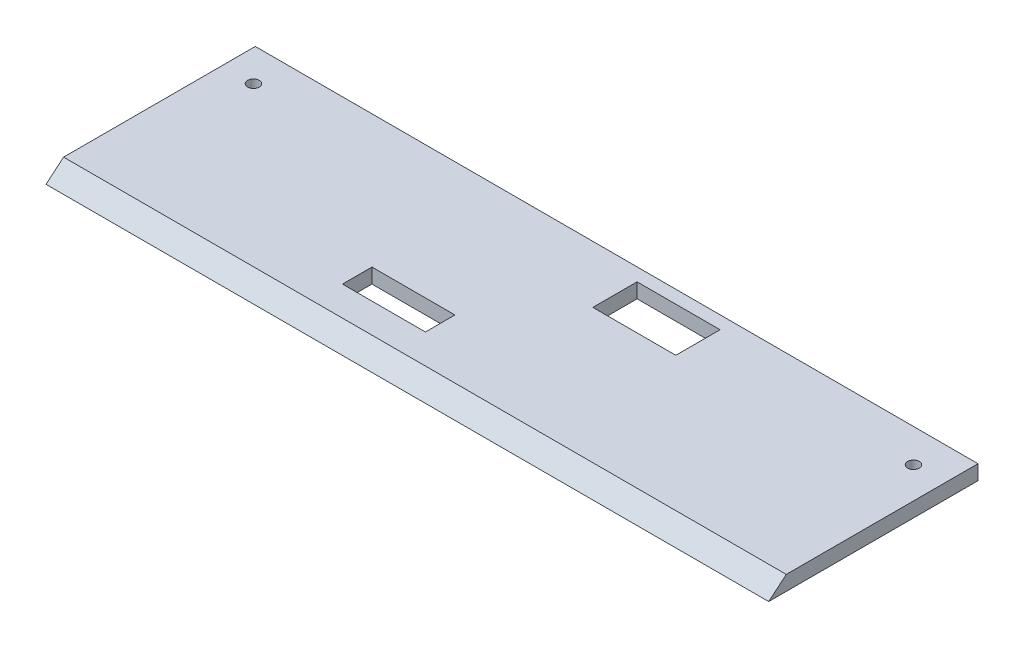
ISO-10303-21;
HEADER;
FILE_DESCRIPTION(('STEP AP214'),'2;1');
FILE_NAME('part.step','',(''),(''),'','','');
FILE_SCHEMA(('AUTOMOTIVE_DESIGN { 1 0 10303 214 1 1 1 1 }'));
ENDSEC;
DATA;
#1=APPLICATION_CONTEXT('core data for automotive mechanical design processes');
#2=APPLICATION_PROTOCOL_DEFINITION('international standard','automotive_design',2000,#1);
#3=PRODUCT_CONTEXT('',#1,'mechanical');
#4=PRODUCT('Part','Part','',(#3));
#5=PRODUCT_RELATED_PRODUCT_CATEGORY('part','',(#4));
#6=PRODUCT_DEFINITION_FORMATION('','',#4);
#7=PRODUCT_DEFINITION_CONTEXT('part definition',#1,'design');
#8=PRODUCT_DEFINITION('design','',#6,#7);
#9=PRODUCT_DEFINITION_SHAPE('','',#8);
#10=(LENGTH_UNIT() NAMED_UNIT(*) SI_UNIT(.MILLI.,.METRE.));
#11=(NAMED_UNIT(*) PLANE_ANGLE_UNIT() SI_UNIT($,.RADIAN.));
#12=(NAMED_UNIT(*) SI_UNIT($,.STERADIAN.) SOLID_ANGLE_UNIT());
#13=UNCERTAINTY_MEASURE_WITH_UNIT(LENGTH_MEASURE(1.E-05),#10,'distance_accuracy_value','');
#14=(GEOMETRIC_REPRESENTATION_CONTEXT(3) GLOBAL_UNCERTAINTY_ASSIGNED_CONTEXT((#13)) GLOBAL_UNIT_ASSIGNED_CONTEXT((#10,
#11,#12)) REPRESENTATION_CONTEXT('',''));
#15=CARTESIAN_POINT('',(0.,0.,0.));
#16=DIRECTION('',(0.,0.,1.));
#17=DIRECTION('',(1.,0.,0.));
#18=AXIS2_PLACEMENT_3D('',#15,#16,#17);
#19=CARTESIAN_POINT('',(0.,41.19,0.));
#20=DIRECTION('',(0.,-1.,0.));
#21=DIRECTION('',(0.,0.,-1.));
#22=AXIS2_PLACEMENT_3D('',#19,#20,#21);
#23=PLANE('',#22);
#24=DIRECTION('',(0.,0.,-1.));
#25=VECTOR('',#24,1.);
#26=CARTESIAN_POINT('',(0.,41.19,0.));
#27=LINE('',#26,#25);
#28=CARTESIAN_POINT('',(0.,41.19,-49.0883304789554));
#29=VERTEX_POINT('',#28);
#30=CARTESIAN_POINT('',(0.,41.19,-105.85));
#31=VERTEX_POINT('',#30);
#32=EDGE_CURVE('E150',#29,#31,#27,.T.);
#33=ORIENTED_EDGE('',*,*,#32,.T.);
#34=DIRECTION('',(1.,0.,0.));
#35=VECTOR('',#34,1.);
#36=CARTESIAN_POINT('',(159.,41.19,-105.85));
#37=LINE('',#36,#35);
#38=CARTESIAN_POINT('',(196.,41.19,-105.85));
#39=VERTEX_POINT('',#38);
#40=EDGE_CURVE('E207',#31,#39,#37,.T.);
#41=ORIENTED_EDGE('',*,*,#40,.T.);
#42=DIRECTION('',(0.,0.,-1.));
#43=VECTOR('',#42,1.);
#44=CARTESIAN_POINT('',(196.,41.19,0.));
#45=LINE('',#44,#43);
#46=CARTESIAN_POINT('',(196.,41.19,-49.0883304789554));
#47=VERTEX_POINT('',#46);
#48=EDGE_CURVE('E152',#47,#39,#45,.T.);
#49=ORIENTED_EDGE('',*,*,#48,.F.);
#50=DIRECTION('',(-1.,0.,0.));
#51=VECTOR('',#50,1.);
#52=CARTESIAN_POINT('',(196.,41.19,-49.0883304789554));
#53=LINE('',#52,#51);
#54=EDGE_CURVE('E138',#47,#29,#53,.T.);
#55=ORIENTED_EDGE('',*,*,#54,.T.);
#56=EDGE_LOOP('',(#33,#41,#49,#55));
#57=FACE_BOUND('',#56,.T.);
#58=CARTESIAN_POINT('',(187.5,41.19,-96.85));
#59=DIRECTION('',(0.,-1.,0.));
#60=DIRECTION('',(0.,0.,-1.));
#61=AXIS2_PLACEMENT_3D('',#58,#59,#60);
#62=CIRCLE('',#61,1.58499999999999);
#63=CARTESIAN_POINT('',(187.5,41.19,-95.265));
#64=VERTEX_POINT('',#63);
#65=EDGE_CURVE('E236',#64,#64,#62,.T.);
#66=ORIENTED_EDGE('',*,*,#65,.F.);
#67=EDGE_LOOP('',(#66));
#68=FACE_BOUND('',#67,.T.);
#69=CARTESIAN_POINT('',(8.5,41.19,-96.85));
#70=DIRECTION('',(0.,-1.,0.));
#71=DIRECTION('',(0.,0.,-1.));
#72=AXIS2_PLACEMENT_3D('',#69,#70,#71);
#73=CIRCLE('',#72,1.58499999999999);
#74=CARTESIAN_POINT('',(8.5,41.19,-98.435));
#75=VERTEX_POINT('',#74);
#76=EDGE_CURVE('E156',#75,#75,#73,.F.);
#77=ORIENTED_EDGE('',*,*,#76,.T.);
#78=EDGE_LOOP('',(#77));
#79=FACE_BOUND('',#78,.T.);
#80=DIRECTION('',(0.,0.,1.));
#81=VECTOR('',#80,1.);
#82=CARTESIAN_POINT('',(107.057542755314,41.19,-102.335344849332));
#83=LINE('',#82,#81);
#84=CARTESIAN_POINT('',(107.057542755314,41.19,-102.335344849332));
#85=VERTEX_POINT('',#84);
#86=CARTESIAN_POINT('',(107.057542755314,41.19,-90.3353448493322));
#87=VERTEX_POINT('',#86);
#88=EDGE_CURVE('E223',#85,#87,#83,.T.);
#89=ORIENTED_EDGE('',*,*,#88,.T.);
#90=DIRECTION('',(1.,0.,0.));
#91=VECTOR('',#90,1.);
#92=CARTESIAN_POINT('',(107.057542755314,41.19,-90.3353448493322));
#93=LINE('',#92,#91);
#94=CARTESIAN_POINT('',(129.557542755314,41.19,-90.3353448493322));
#95=VERTEX_POINT('',#94);
#96=EDGE_CURVE('E231',#87,#95,#93,.T.);
#97=ORIENTED_EDGE('',*,*,#96,.T.);
#98=DIRECTION('',(0.,0.,-1.));
#99=VECTOR('',#98,1.);
#100=CARTESIAN_POINT('',(129.557542755314,41.19,-102.335344849332));
#101=LINE('',#100,#99);
#102=CARTESIAN_POINT('',(129.557542755314,41.19,-102.335344849332));
#103=VERTEX_POINT('',#102);
#104=EDGE_CURVE('E228',#95,#103,#101,.T.);
#105=ORIENTED_EDGE('',*,*,#104,.T.);
#106=DIRECTION('',(-1.,0.,0.));
#107=VECTOR('',#106,1.);
#108=CARTESIAN_POINT('',(107.057542755314,41.19,-102.335344849332));
#109=LINE('',#108,#107);
#110=EDGE_CURVE('E216',#103,#85,#109,.T.);
#111=ORIENTED_EDGE('',*,*,#110,.T.);
#112=EDGE_LOOP('',(#89,#97,#105,#111));
#113=FACE_BOUND('',#112,.T.);
#114=DIRECTION('',(0.,0.,1.));
#115=VECTOR('',#114,1.);
#116=CARTESIAN_POINT('',(67.6351039484169,41.19,-61.8553448493322));
#117=LINE('',#116,#115);
#118=CARTESIAN_POINT('',(67.6351039484169,41.19,-69.8553448493322));
#119=VERTEX_POINT('',#118);
#120=CARTESIAN_POINT('',(67.6351039484169,41.19,-61.8553448493322));
#121=VERTEX_POINT('',#120);
#122=EDGE_CURVE('E198',#119,#121,#117,.T.);
#123=ORIENTED_EDGE('',*,*,#122,.T.);
#124=DIRECTION('',(1.,0.,0.));
#125=VECTOR('',#124,1.);
#126=CARTESIAN_POINT('',(67.6351039484169,41.19,-61.8553448493322));
#127=LINE('',#126,#125);
#128=CARTESIAN_POINT('',(90.1351039484169,41.19,-61.8553448493322));
#129=VERTEX_POINT('',#128);
#130=EDGE_CURVE('E145',#121,#129,#127,.T.);
#131=ORIENTED_EDGE('',*,*,#130,.T.);
#132=DIRECTION('',(0.,0.,-1.));
#133=VECTOR('',#132,1.);
#134=CARTESIAN_POINT('',(90.1351039484169,41.19,-61.8553448493322));
#135=LINE('',#134,#133);
#136=CARTESIAN_POINT('',(90.1351039484169,41.19,-69.8553448493322));
#137=VERTEX_POINT('',#136);
#138=EDGE_CURVE('E204',#129,#137,#135,.T.);
#139=ORIENTED_EDGE('',*,*,#138,.T.);
#140=DIRECTION('',(-1.,0.,0.));
#141=VECTOR('',#140,1.);
#142=CARTESIAN_POINT('',(67.6351039484169,41.19,-69.8553448493322));
#143=LINE('',#142,#141);
#144=EDGE_CURVE('E201',#137,#119,#143,.T.);
#145=ORIENTED_EDGE('',*,*,#144,.T.);
#146=EDGE_LOOP('',(#123,#131,#139,#145));
#147=FACE_BOUND('',#146,.T.);
#148=ADVANCED_FACE('F38',(#57,#68,#79,#113,#147),#23,.T.);
#149=CARTESIAN_POINT('',(196.,0.,0.));
#150=DIRECTION('',(0.,-0.766044443118977,-0.64278760968654));
#151=DIRECTION('',(0.,0.64278760968654,-0.766044443118977));
#152=AXIS2_PLACEMENT_3D('',#149,#150,#151);
#153=PLANE('',#152);
#154=ORIENTED_EDGE('',*,*,#54,.F.);
#155=DIRECTION('',(0.,-0.64278760968654,0.766044443118977));
#156=VECTOR('',#155,1.);
#157=CARTESIAN_POINT('',(196.,0.,0.));
#158=LINE('',#157,#156);
#159=CARTESIAN_POINT('',(196.,45.19,-53.8553448493322));
#160=VERTEX_POINT('',#159);
#161=EDGE_CURVE('E164',#160,#47,#158,.T.);
#162=ORIENTED_EDGE('',*,*,#161,.F.);
#163=DIRECTION('',(-1.,0.,0.));
#164=VECTOR('',#163,1.);
#165=CARTESIAN_POINT('',(196.,45.19,-53.8553448493322));
#166=LINE('',#165,#164);
#167=CARTESIAN_POINT('',(0.,45.19,-53.8553448493322));
#168=VERTEX_POINT('',#167);
#169=EDGE_CURVE('E141',#160,#168,#166,.T.);
#170=ORIENTED_EDGE('',*,*,#169,.T.);
#171=DIRECTION('',(0.,-0.64278760968654,0.766044443118977));
#172=VECTOR('',#171,1.);
#173=CARTESIAN_POINT('',(0.,0.,0.));
#174=LINE('',#173,#172);
#175=EDGE_CURVE('E42',#168,#29,#174,.T.);
#176=ORIENTED_EDGE('',*,*,#175,.T.);
#177=EDGE_LOOP('',(#154,#162,#170,#176));
#178=FACE_BOUND('',#177,.T.);
#179=ADVANCED_FACE('F136',(#178),#153,.F.);
#180=CARTESIAN_POINT('',(196.,0.,-105.85));
#181=DIRECTION('',(0.,0.,1.));
#182=DIRECTION('',(1.,0.,0.));
#183=AXIS2_PLACEMENT_3D('',#180,#181,#182);
#184=PLANE('',#183);
#185=ORIENTED_EDGE('',*,*,#40,.F.);
#186=DIRECTION('',(0.,1.,0.));
#187=VECTOR('',#186,1.);
#188=CARTESIAN_POINT('',(0.,0.,-105.85));
#189=LINE('',#188,#187);
#190=CARTESIAN_POINT('',(0.,45.19,-105.85));
#191=VERTEX_POINT('',#190);
#192=EDGE_CURVE('E146',#31,#191,#189,.T.);
#193=ORIENTED_EDGE('',*,*,#192,.T.);
#194=DIRECTION('',(-1.,0.,0.));
#195=VECTOR('',#194,1.);
#196=CARTESIAN_POINT('',(196.,45.19,-105.85));
#197=LINE('',#196,#195);
#198=CARTESIAN_POINT('',(196.,45.19,-105.85));
#199=VERTEX_POINT('',#198);
#200=EDGE_CURVE('E238',#199,#191,#197,.T.);
#201=ORIENTED_EDGE('',*,*,#200,.F.);
#202=DIRECTION('',(0.,1.,0.));
#203=VECTOR('',#202,1.);
#204=CARTESIAN_POINT('',(196.,0.,-105.85));
#205=LINE('',#204,#203);
#206=EDGE_CURVE('E162',#39,#199,#205,.T.);
#207=ORIENTED_EDGE('',*,*,#206,.F.);
#208=EDGE_LOOP('',(#185,#193,#201,#207));
#209=FACE_BOUND('',#208,.T.);
#210=ADVANCED_FACE('F241',(#209),#184,.F.);
#211=CARTESIAN_POINT('',(196.,0.,0.));
#212=DIRECTION('',(1.,0.,0.));
#213=DIRECTION('',(0.,0.,-1.));
#214=AXIS2_PLACEMENT_3D('',#211,#212,#213);
#215=PLANE('',#214);
#216=ORIENTED_EDGE('',*,*,#161,.T.);
#217=ORIENTED_EDGE('',*,*,#48,.T.);
#218=ORIENTED_EDGE('',*,*,#206,.T.);
#219=DIRECTION('',(0.,0.,1.));
#220=VECTOR('',#219,1.);
#221=CARTESIAN_POINT('',(196.,45.19,-105.85));
#222=LINE('',#221,#220);
#223=EDGE_CURVE('E165',#199,#160,#222,.T.);
#224=ORIENTED_EDGE('',*,*,#223,.T.);
#225=EDGE_LOOP('',(#216,#217,#218,#224));
#226=FACE_BOUND('',#225,.T.);
#227=ADVANCED_FACE('F40',(#226),#215,.T.);
#228=CARTESIAN_POINT('',(0.,0.,0.));
#229=DIRECTION('',(1.,0.,0.));
#230=DIRECTION('',(0.,0.,-1.));
#231=AXIS2_PLACEMENT_3D('',#228,#229,#230);
#232=PLANE('',#231);
#233=ORIENTED_EDGE('',*,*,#32,.F.);
#234=ORIENTED_EDGE('',*,*,#175,.F.);
#235=DIRECTION('',(0.,0.,1.));
#236=VECTOR('',#235,1.);
#237=CARTESIAN_POINT('',(0.,45.19,-105.85));
#238=LINE('',#237,#236);
#239=EDGE_CURVE('E166',#191,#168,#238,.T.);
#240=ORIENTED_EDGE('',*,*,#239,.F.);
#241=ORIENTED_EDGE('',*,*,#192,.F.);
#242=EDGE_LOOP('',(#233,#234,#240,#241));
#243=FACE_BOUND('',#242,.T.);
#244=ADVANCED_FACE('F155',(#243),#232,.F.);
#245=CARTESIAN_POINT('',(8.5,0.,-96.85));
#246=DIRECTION('',(0.,1.,0.));
#247=DIRECTION('',(0.,0.,1.));
#248=AXIS2_PLACEMENT_3D('',#245,#246,#247);
#249=CYLINDRICAL_SURFACE('',#248,1.58499999999999);
#250=CARTESIAN_POINT('',(8.5,45.19,-96.85));
#251=DIRECTION('',(0.,1.,0.));
#252=DIRECTION('',(0.,0.,1.));
#253=AXIS2_PLACEMENT_3D('',#250,#251,#252);
#254=CIRCLE('',#253,1.58499999999999);
#255=CARTESIAN_POINT('',(8.5,45.19,-95.265));
#256=VERTEX_POINT('',#255);
#257=EDGE_CURVE('E209',#256,#256,#254,.T.);
#258=ORIENTED_EDGE('',*,*,#257,.T.);
#259=EDGE_LOOP('',(#258));
#260=FACE_BOUND('',#259,.T.);
#261=ORIENTED_EDGE('',*,*,#76,.F.);
#262=EDGE_LOOP('',(#261));
#263=FACE_BOUND('',#262,.T.);
#264=ADVANCED_FACE('F256',(#260,#263),#249,.F.);
#265=CARTESIAN_POINT('',(187.5,0.,-96.85));
#266=DIRECTION('',(0.,1.,0.));
#267=DIRECTION('',(0.,0.,1.));
#268=AXIS2_PLACEMENT_3D('',#265,#266,#267);
#269=CYLINDRICAL_SURFACE('',#268,1.58499999999999);
#270=CARTESIAN_POINT('',(187.5,45.19,-96.85));
#271=DIRECTION('',(0.,-1.,0.));
#272=DIRECTION('',(0.,0.,1.));
#273=AXIS2_PLACEMENT_3D('',#270,#271,#272);
#274=CIRCLE('',#273,1.58499999999999);
#275=CARTESIAN_POINT('',(187.5,45.19,-95.265));
#276=VERTEX_POINT('',#275);
#277=EDGE_CURVE('E212',#276,#276,#274,.T.);
#278=CARTESIAN_POINT('',(187.5,45.19,-95.265));
#279=CARTESIAN_POINT('',(187.5,45.1483333333333,-95.265));
#280=CARTESIAN_POINT('',(187.5,45.1066666666667,-95.265));
#281=CARTESIAN_POINT('',(187.5,45.0233333333333,-95.265));
#282=CARTESIAN_POINT('',(187.5,44.9816666666667,-95.265));
#283=CARTESIAN_POINT('',(187.5,44.8983333333333,-95.265));
#284=CARTESIAN_POINT('',(187.5,44.8566666666667,-95.265));
#285=CARTESIAN_POINT('',(187.5,44.7733333333333,-95.265));
#286=CARTESIAN_POINT('',(187.5,44.7316666666667,-95.265));
#287=CARTESIAN_POINT('',(187.5,44.6483333333333,-95.265));
#288=CARTESIAN_POINT('',(187.5,44.6066666666667,-95.265));
#289=CARTESIAN_POINT('',(187.5,44.5233333333333,-95.265));
#290=CARTESIAN_POINT('',(187.5,44.4816666666667,-95.265));
#291=CARTESIAN_POINT('',(187.5,44.3983333333333,-95.265));
#292=CARTESIAN_POINT('',(187.5,44.3566666666667,-95.265));
#293=CARTESIAN_POINT('',(187.5,44.2733333333333,-95.265));
#294=CARTESIAN_POINT('',(187.5,44.2316666666667,-95.265));
#295=CARTESIAN_POINT('',(187.5,44.1483333333333,-95.265));
#296=CARTESIAN_POINT('',(187.5,44.1066666666667,-95.265));
#297=CARTESIAN_POINT('',(187.5,44.0233333333333,-95.265));
#298=CARTESIAN_POINT('',(187.5,43.9816666666667,-95.265));
#299=CARTESIAN_POINT('',(187.5,43.8983333333333,-95.265));
#300=CARTESIAN_POINT('',(187.5,43.8566666666667,-95.265));
#301=CARTESIAN_POINT('',(187.5,43.7733333333333,-95.265));
#302=CARTESIAN_POINT('',(187.5,43.7316666666667,-95.265));
#303=CARTESIAN_POINT('',(187.5,43.6483333333333,-95.265));
#304=CARTESIAN_POINT('',(187.5,43.6066666666667,-95.265));
#305=CARTESIAN_POINT('',(187.5,43.5233333333333,-95.265));
#306=CARTESIAN_POINT('',(187.5,43.4816666666667,-95.265));
#307=CARTESIAN_POINT('',(187.5,43.3983333333333,-95.265));
#308=CARTESIAN_POINT('',(187.5,43.3566666666667,-95.265));
#309=CARTESIAN_POINT('',(187.5,43.2733333333333,-95.265));
#310=CARTESIAN_POINT('',(187.5,43.2316666666667,-95.265));
#311=CARTESIAN_POINT('',(187.5,43.1483333333333,-95.265));
#312=CARTESIAN_POINT('',(187.5,43.1066666666667,-95.265));
#313=CARTESIAN_POINT('',(187.5,43.0233333333333,-95.265));
#314=CARTESIAN_POINT('',(187.5,42.9816666666667,-95.265));
#315=CARTESIAN_POINT('',(187.5,42.8983333333333,-95.265));
#316=CARTESIAN_POINT('',(187.5,42.8566666666667,-95.265));
#317=CARTESIAN_POINT('',(187.5,42.7733333333333,-95.265));
#318=CARTESIAN_POINT('',(187.5,42.7316666666667,-95.265));
#319=CARTESIAN_POINT('',(187.5,42.6483333333333,-95.265));
#320=CARTESIAN_POINT('',(187.5,42.6066666666667,-95.265));
#321=CARTESIAN_POINT('',(187.5,42.5233333333333,-95.265));
#322=CARTESIAN_POINT('',(187.5,42.4816666666667,-95.265));
#323=CARTESIAN_POINT('',(187.5,42.3983333333333,-95.265));
#324=CARTESIAN_POINT('',(187.5,42.3566666666667,-95.265));
#325=CARTESIAN_POINT('',(187.5,42.2733333333333,-95.265));
#326=CARTESIAN_POINT('',(187.5,42.2316666666667,-95.265));
#327=CARTESIAN_POINT('',(187.5,42.1483333333333,-95.265));
#328=CARTESIAN_POINT('',(187.5,42.1066666666667,-95.265));
#329=CARTESIAN_POINT('',(187.5,42.0233333333333,-95.265));
#330=CARTESIAN_POINT('',(187.5,41.9816666666667,-95.265));
#331=CARTESIAN_POINT('',(187.5,41.8983333333333,-95.265));
#332=CARTESIAN_POINT('',(187.5,41.8566666666667,-95.265));
#333=CARTESIAN_POINT('',(187.5,41.7733333333333,-95.265));
#334=CARTESIAN_POINT('',(187.5,41.7316666666667,-95.265));
#335=CARTESIAN_POINT('',(187.5,41.6483333333333,-95.265));
#336=CARTESIAN_POINT('',(187.5,41.6066666666667,-95.265));
#337=CARTESIAN_POINT('',(187.5,41.5233333333333,-95.265));
#338=CARTESIAN_POINT('',(187.5,41.4816666666667,-95.265));
#339=CARTESIAN_POINT('',(187.5,41.3983333333333,-95.265));
#340=CARTESIAN_POINT('',(187.5,41.3566666666667,-95.265));
#341=CARTESIAN_POINT('',(187.5,41.2733333333333,-95.265));
#342=CARTESIAN_POINT('',(187.5,41.2316666666667,-95.265));
#343=CARTESIAN_POINT('',(187.5,41.19,-95.265));
#344=B_SPLINE_CURVE_WITH_KNOTS('',3,(#278,#279,#280,#281,#282,#283,#284,#285,#286,#287,#288,
#289,#290,#291,#292,#293,#294,#295,#296,#297,#298,#299,#300,#301,#302,#303,#304,#305,#306,#307,
#308,#309,#310,#311,#312,#313,#314,#315,#316,#317,#318,#319,#320,#321,#322,#323,#324,#325,#326,
#327,#328,#329,#330,#331,#332,#333,#334,#335,#336,#337,#338,#339,#340,#341,#342,#343),
.UNSPECIFIED.,.F.,.F.,(4,2,2,2,2,2,2,2,2,2,2,2,2,2,2,2,2,2,2,2,2,2,2,2,2,2,2,2,2,2,2,2,4),(0.,
0.125,0.25,0.375,0.5,0.625000000000001,0.750000000000001,0.875000000000001,1.,1.125,1.25,1.375,
1.5,1.625,1.75,1.875,2.,2.125,2.25,2.375,2.5,2.625,2.75,2.875,3.,3.125,3.25,3.375,3.5,3.625,
3.75,3.875,4.),.UNSPECIFIED.);
#345=EDGE_CURVE('BSEAM246',#276,#64,#344,.T.);
#346=ORIENTED_EDGE('',*,*,#277,.F.);
#347=ORIENTED_EDGE('',*,*,#65,.T.);
#348=ORIENTED_EDGE('',*,*,#345,.T.);
#349=ORIENTED_EDGE('',*,*,#345,.F.);
#350=EDGE_LOOP('',(#346,#348,#347,#349));
#351=FACE_BOUND('',#350,.T.);
#352=ADVANCED_FACE('F246',(#351),#269,.F.);
#353=CARTESIAN_POINT('',(196.,45.19,-105.85));
#354=DIRECTION('',(0.,-1.,0.));
#355=DIRECTION('',(0.,0.,-1.));
#356=AXIS2_PLACEMENT_3D('',#353,#354,#355);
#357=PLANE('',#356);
#358=DIRECTION('',(1.,0.,0.));
#359=VECTOR('',#358,1.);
#360=CARTESIAN_POINT('',(107.057542755314,45.19,-90.3353448493322));
#361=LINE('',#360,#359);
#362=CARTESIAN_POINT('',(107.057542755314,45.19,-90.3353448493322));
#363=VERTEX_POINT('',#362);
#364=CARTESIAN_POINT('',(129.557542755314,45.19,-90.3353448493322));
#365=VERTEX_POINT('',#364);
#366=EDGE_CURVE('E48',#363,#365,#361,.T.);
#367=ORIENTED_EDGE('',*,*,#366,.F.);
#368=DIRECTION('',(0.,0.,1.));
#369=VECTOR('',#368,1.);
#370=CARTESIAN_POINT('',(107.057542755314,45.19,-102.335344849332));
#371=LINE('',#370,#369);
#372=CARTESIAN_POINT('',(107.057542755314,45.19,-102.335344849332));
#373=VERTEX_POINT('',#372);
#374=EDGE_CURVE('E11',#373,#363,#371,.T.);
#375=ORIENTED_EDGE('',*,*,#374,.F.);
#376=DIRECTION('',(-1.,0.,0.));
#377=VECTOR('',#376,1.);
#378=CARTESIAN_POINT('',(107.057542755314,45.19,-102.335344849332));
#379=LINE('',#378,#377);
#380=CARTESIAN_POINT('',(129.557542755314,45.19,-102.335344849332));
#381=VERTEX_POINT('',#380);
#382=EDGE_CURVE('E220',#381,#373,#379,.T.);
#383=ORIENTED_EDGE('',*,*,#382,.F.);
#384=DIRECTION('',(0.,0.,-1.));
#385=VECTOR('',#384,1.);
#386=CARTESIAN_POINT('',(129.557542755314,45.19,-102.335344849332));
#387=LINE('',#386,#385);
#388=EDGE_CURVE('E222',#365,#381,#387,.T.);
#389=ORIENTED_EDGE('',*,*,#388,.F.);
#390=EDGE_LOOP('',(#367,#375,#383,#389));
#391=FACE_BOUND('',#390,.T.);
#392=ORIENTED_EDGE('',*,*,#277,.T.);
#393=EDGE_LOOP('',(#392));
#394=FACE_BOUND('',#393,.T.);
#395=ORIENTED_EDGE('',*,*,#257,.F.);
#396=EDGE_LOOP('',(#395));
#397=FACE_BOUND('',#396,.T.);
#398=DIRECTION('',(1.,0.,0.));
#399=VECTOR('',#398,1.);
#400=CARTESIAN_POINT('',(67.6351039484169,45.19,-61.8553448493322));
#401=LINE('',#400,#399);
#402=CARTESIAN_POINT('',(67.6351039484169,45.19,-61.8553448493322));
#403=VERTEX_POINT('',#402);
#404=CARTESIAN_POINT('',(90.1351039484169,45.19,-61.8553448493322));
#405=VERTEX_POINT('',#404);
#406=EDGE_CURVE('E193',#403,#405,#401,.T.);
#407=ORIENTED_EDGE('',*,*,#406,.F.);
#408=DIRECTION('',(0.,0.,1.));
#409=VECTOR('',#408,1.);
#410=CARTESIAN_POINT('',(67.6351039484169,45.19,-61.8553448493322));
#411=LINE('',#410,#409);
#412=CARTESIAN_POINT('',(67.6351039484169,45.19,-69.8553448493322));
#413=VERTEX_POINT('',#412);
#414=EDGE_CURVE('E196',#413,#403,#411,.T.);
#415=ORIENTED_EDGE('',*,*,#414,.F.);
#416=DIRECTION('',(-1.,0.,0.));
#417=VECTOR('',#416,1.);
#418=CARTESIAN_POINT('',(67.6351039484169,45.19,-69.8553448493322));
#419=LINE('',#418,#417);
#420=CARTESIAN_POINT('',(90.1351039484169,45.19,-69.8553448493322));
#421=VERTEX_POINT('',#420);
#422=EDGE_CURVE('E182',#421,#413,#419,.T.);
#423=ORIENTED_EDGE('',*,*,#422,.F.);
#424=DIRECTION('',(0.,0.,-1.));
#425=VECTOR('',#424,1.);
#426=CARTESIAN_POINT('',(90.1351039484169,45.19,-61.8553448493322));
#427=LINE('',#426,#425);
#428=EDGE_CURVE('E190',#405,#421,#427,.T.);
#429=ORIENTED_EDGE('',*,*,#428,.F.);
#430=EDGE_LOOP('',(#407,#415,#423,#429));
#431=FACE_BOUND('',#430,.T.);
#432=ORIENTED_EDGE('',*,*,#239,.T.);
#433=ORIENTED_EDGE('',*,*,#169,.F.);
#434=ORIENTED_EDGE('',*,*,#223,.F.);
#435=ORIENTED_EDGE('',*,*,#200,.T.);
#436=EDGE_LOOP('',(#432,#433,#434,#435));
#437=FACE_BOUND('',#436,.T.);
#438=ADVANCED_FACE('F243',(#391,#394,#397,#431,#437),#357,.F.);
#439=CARTESIAN_POINT('',(67.6351039484169,-0.001000000000001,-61.8553448493322));
#440=DIRECTION('',(-1.,0.,0.));
#441=DIRECTION('',(0.,0.,1.));
#442=AXIS2_PLACEMENT_3D('',#439,#440,#441);
#443=PLANE('',#442);
#444=DIRECTION('',(0.,1.,0.));
#445=VECTOR('',#444,1.);
#446=CARTESIAN_POINT('',(67.6351039484169,-0.001000000000001,-69.8553448493322));
#447=LINE('',#446,#445);
#448=EDGE_CURVE('E178',#119,#413,#447,.T.);
#449=ORIENTED_EDGE('',*,*,#448,.T.);
#450=ORIENTED_EDGE('',*,*,#414,.T.);
#451=DIRECTION('',(0.,1.,0.));
#452=VECTOR('',#451,1.);
#453=CARTESIAN_POINT('',(67.6351039484169,-0.001000000000001,-61.8553448493322));
#454=LINE('',#453,#452);
#455=EDGE_CURVE('E179',#121,#403,#454,.T.);
#456=ORIENTED_EDGE('',*,*,#455,.F.);
#457=ORIENTED_EDGE('',*,*,#122,.F.);
#458=EDGE_LOOP('',(#449,#450,#456,#457));
#459=FACE_BOUND('',#458,.T.);
#460=ADVANCED_FACE('F245',(#459),#443,.F.);
#461=CARTESIAN_POINT('',(67.6351039484169,-0.001000000000001,-69.8553448493322));
#462=DIRECTION('',(0.,0.,-1.));
#463=DIRECTION('',(-1.,0.,0.));
#464=AXIS2_PLACEMENT_3D('',#461,#462,#463);
#465=PLANE('',#464);
#466=DIRECTION('',(0.,1.,0.));
#467=VECTOR('',#466,1.);
#468=CARTESIAN_POINT('',(90.1351039484169,-0.001000000000001,-69.8553448493322));
#469=LINE('',#468,#467);
#470=EDGE_CURVE('E185',#137,#421,#469,.T.);
#471=ORIENTED_EDGE('',*,*,#470,.T.);
#472=ORIENTED_EDGE('',*,*,#422,.T.);
#473=ORIENTED_EDGE('',*,*,#448,.F.);
#474=ORIENTED_EDGE('',*,*,#144,.F.);
#475=EDGE_LOOP('',(#471,#472,#473,#474));
#476=FACE_BOUND('',#475,.T.);
#477=ADVANCED_FACE('F253',(#476),#465,.F.);
#478=CARTESIAN_POINT('',(90.1351039484169,-0.001000000000001,-61.8553448493322));
#479=DIRECTION('',(1.,0.,0.));
#480=DIRECTION('',(0.,0.,-1.));
#481=AXIS2_PLACEMENT_3D('',#478,#479,#480);
#482=PLANE('',#481);
#483=DIRECTION('',(0.,1.,0.));
#484=VECTOR('',#483,1.);
#485=CARTESIAN_POINT('',(90.1351039484169,-0.001000000000001,-61.8553448493322));
#486=LINE('',#485,#484);
#487=EDGE_CURVE('E183',#129,#405,#486,.T.);
#488=ORIENTED_EDGE('',*,*,#487,.T.);
#489=ORIENTED_EDGE('',*,*,#428,.T.);
#490=ORIENTED_EDGE('',*,*,#470,.F.);
#491=ORIENTED_EDGE('',*,*,#138,.F.);
#492=EDGE_LOOP('',(#488,#489,#490,#491));
#493=FACE_BOUND('',#492,.T.);
#494=ADVANCED_FACE('F363',(#493),#482,.F.);
#495=CARTESIAN_POINT('',(67.6351039484169,-0.001000000000001,-61.8553448493322));
#496=DIRECTION('',(0.,0.,1.));
#497=DIRECTION('',(1.,0.,0.));
#498=AXIS2_PLACEMENT_3D('',#495,#496,#497);
#499=PLANE('',#498);
#500=ORIENTED_EDGE('',*,*,#455,.T.);
#501=ORIENTED_EDGE('',*,*,#406,.T.);
#502=ORIENTED_EDGE('',*,*,#487,.F.);
#503=ORIENTED_EDGE('',*,*,#130,.F.);
#504=EDGE_LOOP('',(#500,#501,#502,#503));
#505=FACE_BOUND('',#504,.T.);
#506=ADVANCED_FACE('F372',(#505),#499,.F.);
#507=CARTESIAN_POINT('',(107.057542755314,41.19,-102.335344849332));
#508=DIRECTION('',(-1.,0.,0.));
#509=DIRECTION('',(0.,0.,1.));
#510=AXIS2_PLACEMENT_3D('',#507,#508,#509);
#511=PLANE('',#510);
#512=ORIENTED_EDGE('',*,*,#374,.T.);
#513=DIRECTION('',(0.,1.,0.));
#514=VECTOR('',#513,1.);
#515=CARTESIAN_POINT('',(107.057542755314,41.19,-90.3353448493322));
#516=LINE('',#515,#514);
#517=EDGE_CURVE('E75',#87,#363,#516,.T.);
#518=ORIENTED_EDGE('',*,*,#517,.F.);
#519=ORIENTED_EDGE('',*,*,#88,.F.);
#520=DIRECTION('',(0.,1.,0.));
#521=VECTOR('',#520,1.);
#522=CARTESIAN_POINT('',(107.057542755314,41.19,-102.335344849332));
#523=LINE('',#522,#521);
#524=EDGE_CURVE('E78',#85,#373,#523,.T.);
#525=ORIENTED_EDGE('',*,*,#524,.T.);
#526=EDGE_LOOP('',(#512,#518,#519,#525));
#527=FACE_BOUND('',#526,.T.);
#528=ADVANCED_FACE('F382',(#527),#511,.F.);
#529=CARTESIAN_POINT('',(107.057542755314,41.19,-102.335344849332));
#530=DIRECTION('',(0.,0.,-1.));
#531=DIRECTION('',(-1.,0.,0.));
#532=AXIS2_PLACEMENT_3D('',#529,#530,#531);
#533=PLANE('',#532);
#534=ORIENTED_EDGE('',*,*,#382,.T.);
#535=ORIENTED_EDGE('',*,*,#524,.F.);
#536=ORIENTED_EDGE('',*,*,#110,.F.);
#537=DIRECTION('',(0.,1.,0.));
#538=VECTOR('',#537,1.);
#539=CARTESIAN_POINT('',(129.557542755314,41.19,-102.335344849332));
#540=LINE('',#539,#538);
#541=EDGE_CURVE('E69',#103,#381,#540,.T.);
#542=ORIENTED_EDGE('',*,*,#541,.T.);
#543=EDGE_LOOP('',(#534,#535,#536,#542));
#544=FACE_BOUND('',#543,.T.);
#545=ADVANCED_FACE('F392',(#544),#533,.F.);
#546=CARTESIAN_POINT('',(129.557542755314,41.19,-102.335344849332));
#547=DIRECTION('',(1.,0.,0.));
#548=DIRECTION('',(0.,0.,-1.));
#549=AXIS2_PLACEMENT_3D('',#546,#547,#548);
#550=PLANE('',#549);
#551=ORIENTED_EDGE('',*,*,#388,.T.);
#552=ORIENTED_EDGE('',*,*,#541,.F.);
#553=ORIENTED_EDGE('',*,*,#104,.F.);
#554=DIRECTION('',(0.,1.,0.));
#555=VECTOR('',#554,1.);
#556=CARTESIAN_POINT('',(129.557542755314,41.19,-90.3353448493322));
#557=LINE('',#556,#555);
#558=EDGE_CURVE('E57',#95,#365,#557,.T.);
#559=ORIENTED_EDGE('',*,*,#558,.T.);
#560=EDGE_LOOP('',(#551,#552,#553,#559));
#561=FACE_BOUND('',#560,.T.);
#562=ADVANCED_FACE('F401',(#561),#550,.F.);
#563=CARTESIAN_POINT('',(107.057542755314,41.19,-90.3353448493322));
#564=DIRECTION('',(0.,0.,1.));
#565=DIRECTION('',(1.,0.,0.));
#566=AXIS2_PLACEMENT_3D('',#563,#564,#565);
#567=PLANE('',#566);
#568=ORIENTED_EDGE('',*,*,#366,.T.);
#569=ORIENTED_EDGE('',*,*,#558,.F.);
#570=ORIENTED_EDGE('',*,*,#96,.F.);
#571=ORIENTED_EDGE('',*,*,#517,.T.);
#572=EDGE_LOOP('',(#568,#569,#570,#571));
#573=FACE_BOUND('',#572,.T.);
#574=ADVANCED_FACE('F269',(#573),#567,.F.);
#575=CLOSED_SHELL('',(#148,#179,#210,#227,#244,#264,#352,#438,#460,#477,#494,#506,#528,#545,
#562,#574));
#576=MANIFOLD_SOLID_BREP('B2',#575);
#577=ADVANCED_BREP_SHAPE_REPRESENTATION('',(#18,#576),#14);
#578=SHAPE_DEFINITION_REPRESENTATION(#9,#577);
ENDSEC;
END-ISO-10303-21;
